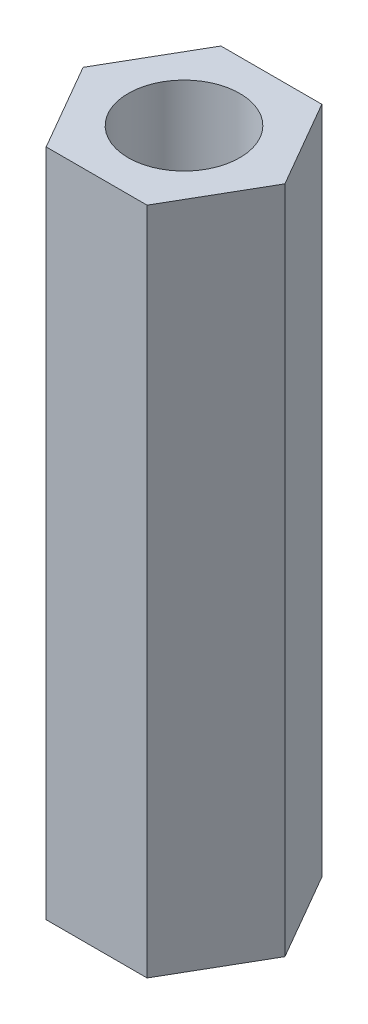
ISO-10303-21;
HEADER;
FILE_DESCRIPTION(('STEP AP214'),'2;1');
FILE_NAME('part.step','',(''),(''),'','','');
FILE_SCHEMA(('AUTOMOTIVE_DESIGN { 1 0 10303 214 1 1 1 1 }'));
ENDSEC;
DATA;
#1=APPLICATION_CONTEXT('core data for automotive mechanical design processes');
#2=APPLICATION_PROTOCOL_DEFINITION('international standard','automotive_design',2000,#1);
#3=PRODUCT_CONTEXT('',#1,'mechanical');
#4=PRODUCT('Part','Part','',(#3));
#5=PRODUCT_RELATED_PRODUCT_CATEGORY('part','',(#4));
#6=PRODUCT_DEFINITION_FORMATION('','',#4);
#7=PRODUCT_DEFINITION_CONTEXT('part definition',#1,'design');
#8=PRODUCT_DEFINITION('design','',#6,#7);
#9=PRODUCT_DEFINITION_SHAPE('','',#8);
#10=(LENGTH_UNIT() NAMED_UNIT(*) SI_UNIT(.MILLI.,.METRE.));
#11=(NAMED_UNIT(*) PLANE_ANGLE_UNIT() SI_UNIT($,.RADIAN.));
#12=(NAMED_UNIT(*) SI_UNIT($,.STERADIAN.) SOLID_ANGLE_UNIT());
#13=UNCERTAINTY_MEASURE_WITH_UNIT(LENGTH_MEASURE(1.E-05),#10,'distance_accuracy_value','');
#14=(GEOMETRIC_REPRESENTATION_CONTEXT(3) GLOBAL_UNCERTAINTY_ASSIGNED_CONTEXT((#13)) GLOBAL_UNIT_ASSIGNED_CONTEXT((#10,
#11,#12)) REPRESENTATION_CONTEXT('',''));
#15=CARTESIAN_POINT('',(0.,0.,0.));
#16=DIRECTION('',(0.,0.,1.));
#17=DIRECTION('',(1.,0.,0.));
#18=AXIS2_PLACEMENT_3D('',#15,#16,#17);
#19=CARTESIAN_POINT('',(0.,18.,0.));
#20=DIRECTION('',(0.,1.,0.));
#21=DIRECTION('',(0.,0.,1.));
#22=AXIS2_PLACEMENT_3D('',#19,#20,#21);
#23=PLANE('',#22);
#24=DIRECTION('',(1.,0.,0.));
#25=VECTOR('',#24,1.);
#26=CARTESIAN_POINT('',(-1.35677313259562,18.,2.35));
#27=LINE('',#26,#25);
#28=CARTESIAN_POINT('',(-1.35677313259562,18.,2.35));
#29=VERTEX_POINT('',#28);
#30=CARTESIAN_POINT('',(1.35677313259562,18.,2.35));
#31=VERTEX_POINT('',#30);
#32=EDGE_CURVE('E135',#29,#31,#27,.T.);
#33=ORIENTED_EDGE('',*,*,#32,.T.);
#34=DIRECTION('',(0.499999999999999,0.,-0.866025403784439));
#35=VECTOR('',#34,1.);
#36=CARTESIAN_POINT('',(1.35677313259562,18.,2.35));
#37=LINE('',#36,#35);
#38=CARTESIAN_POINT('',(2.71354626519124,18.,0.));
#39=VERTEX_POINT('',#38);
#40=EDGE_CURVE('E93',#31,#39,#37,.T.);
#41=ORIENTED_EDGE('',*,*,#40,.T.);
#42=DIRECTION('',(-0.5,0.,-0.866025403784439));
#43=VECTOR('',#42,1.);
#44=CARTESIAN_POINT('',(2.71354626519124,18.,0.));
#45=LINE('',#44,#43);
#46=CARTESIAN_POINT('',(1.35677313259562,18.,-2.35));
#47=VERTEX_POINT('',#46);
#48=EDGE_CURVE('E106',#39,#47,#45,.T.);
#49=ORIENTED_EDGE('',*,*,#48,.T.);
#50=DIRECTION('',(-1.,0.,0.));
#51=VECTOR('',#50,1.);
#52=CARTESIAN_POINT('',(1.35677313259562,18.,-2.35));
#53=LINE('',#52,#51);
#54=CARTESIAN_POINT('',(-1.35677313259562,18.,-2.35));
#55=VERTEX_POINT('',#54);
#56=EDGE_CURVE('E100',#47,#55,#53,.T.);
#57=ORIENTED_EDGE('',*,*,#56,.T.);
#58=DIRECTION('',(-0.499999999999999,0.,0.866025403784439));
#59=VECTOR('',#58,1.);
#60=CARTESIAN_POINT('',(-1.35677313259562,18.,-2.35));
#61=LINE('',#60,#59);
#62=CARTESIAN_POINT('',(-2.71354626519124,18.,0.));
#63=VERTEX_POINT('',#62);
#64=EDGE_CURVE('E104',#55,#63,#61,.T.);
#65=ORIENTED_EDGE('',*,*,#64,.T.);
#66=DIRECTION('',(0.499999999999999,0.,0.866025403784439));
#67=VECTOR('',#66,1.);
#68=CARTESIAN_POINT('',(-2.71354626519124,18.,0.));
#69=LINE('',#68,#67);
#70=EDGE_CURVE('E56',#63,#29,#69,.T.);
#71=ORIENTED_EDGE('',*,*,#70,.T.);
#72=EDGE_LOOP('',(#33,#41,#49,#57,#65,#71));
#73=FACE_BOUND('',#72,.T.);
#74=CARTESIAN_POINT('',(0.,18.,0.));
#75=DIRECTION('',(0.,1.,0.));
#76=DIRECTION('',(0.,0.,1.));
#77=AXIS2_PLACEMENT_3D('',#74,#75,#76);
#78=CIRCLE('',#77,1.5);
#79=CARTESIAN_POINT('',(0.,18.,1.5));
#80=VERTEX_POINT('',#79);
#81=EDGE_CURVE('E128',#80,#80,#78,.T.);
#82=ORIENTED_EDGE('',*,*,#81,.F.);
#83=EDGE_LOOP('',(#82));
#84=FACE_BOUND('',#83,.T.);
#85=ADVANCED_FACE('F39',(#73,#84),#23,.T.);
#86=CARTESIAN_POINT('',(0.,0.,0.));
#87=DIRECTION('',(0.,1.,0.));
#88=DIRECTION('',(0.,0.,1.));
#89=AXIS2_PLACEMENT_3D('',#86,#87,#88);
#90=PLANE('',#89);
#91=DIRECTION('',(1.,0.,0.));
#92=VECTOR('',#91,1.);
#93=CARTESIAN_POINT('',(-1.35677313259562,0.,2.35));
#94=LINE('',#93,#92);
#95=CARTESIAN_POINT('',(-1.35677313259562,0.,2.35));
#96=VERTEX_POINT('',#95);
#97=CARTESIAN_POINT('',(1.35677313259562,0.,2.35));
#98=VERTEX_POINT('',#97);
#99=EDGE_CURVE('E124',#96,#98,#94,.T.);
#100=ORIENTED_EDGE('',*,*,#99,.F.);
#101=DIRECTION('',(0.499999999999999,0.,0.866025403784439));
#102=VECTOR('',#101,1.);
#103=CARTESIAN_POINT('',(-2.71354626519124,0.,0.));
#104=LINE('',#103,#102);
#105=CARTESIAN_POINT('',(-2.71354626519124,0.,0.));
#106=VERTEX_POINT('',#105);
#107=EDGE_CURVE('E85',#106,#96,#104,.T.);
#108=ORIENTED_EDGE('',*,*,#107,.F.);
#109=DIRECTION('',(-0.499999999999999,0.,0.866025403784439));
#110=VECTOR('',#109,1.);
#111=CARTESIAN_POINT('',(-1.35677313259562,0.,-2.35));
#112=LINE('',#111,#110);
#113=CARTESIAN_POINT('',(-1.35677313259562,0.,-2.35));
#114=VERTEX_POINT('',#113);
#115=EDGE_CURVE('E79',#114,#106,#112,.T.);
#116=ORIENTED_EDGE('',*,*,#115,.F.);
#117=DIRECTION('',(-1.,0.,0.));
#118=VECTOR('',#117,1.);
#119=CARTESIAN_POINT('',(1.35677313259562,0.,-2.35));
#120=LINE('',#119,#118);
#121=CARTESIAN_POINT('',(1.35677313259562,0.,-2.35));
#122=VERTEX_POINT('',#121);
#123=EDGE_CURVE('E114',#122,#114,#120,.T.);
#124=ORIENTED_EDGE('',*,*,#123,.F.);
#125=DIRECTION('',(-0.5,0.,-0.866025403784439));
#126=VECTOR('',#125,1.);
#127=CARTESIAN_POINT('',(2.71354626519124,0.,0.));
#128=LINE('',#127,#126);
#129=CARTESIAN_POINT('',(2.71354626519124,0.,0.));
#130=VERTEX_POINT('',#129);
#131=EDGE_CURVE('E130',#130,#122,#128,.T.);
#132=ORIENTED_EDGE('',*,*,#131,.F.);
#133=DIRECTION('',(0.499999999999999,0.,-0.866025403784439));
#134=VECTOR('',#133,1.);
#135=CARTESIAN_POINT('',(1.35677313259562,0.,2.35));
#136=LINE('',#135,#134);
#137=EDGE_CURVE('E127',#98,#130,#136,.T.);
#138=ORIENTED_EDGE('',*,*,#137,.F.);
#139=EDGE_LOOP('',(#100,#108,#116,#124,#132,#138));
#140=FACE_BOUND('',#139,.T.);
#141=CARTESIAN_POINT('',(0.,0.,0.));
#142=DIRECTION('',(0.,1.,0.));
#143=DIRECTION('',(0.,0.,1.));
#144=AXIS2_PLACEMENT_3D('',#141,#142,#143);
#145=CIRCLE('',#144,1.5);
#146=CARTESIAN_POINT('',(0.,0.,1.5));
#147=VERTEX_POINT('',#146);
#148=EDGE_CURVE('E246',#147,#147,#145,.T.);
#149=ORIENTED_EDGE('',*,*,#148,.T.);
#150=EDGE_LOOP('',(#149));
#151=FACE_BOUND('',#150,.T.);
#152=ADVANCED_FACE('F144',(#140,#151),#90,.F.);
#153=CARTESIAN_POINT('',(-1.35677313259562,18.,2.35));
#154=DIRECTION('',(0.,0.,-1.));
#155=DIRECTION('',(-1.,0.,0.));
#156=AXIS2_PLACEMENT_3D('',#153,#154,#155);
#157=PLANE('',#156);
#158=ORIENTED_EDGE('',*,*,#99,.T.);
#159=DIRECTION('',(0.,-1.,0.));
#160=VECTOR('',#159,1.);
#161=CARTESIAN_POINT('',(1.35677313259562,18.,2.35));
#162=LINE('',#161,#160);
#163=EDGE_CURVE('E11',#31,#98,#162,.T.);
#164=ORIENTED_EDGE('',*,*,#163,.F.);
#165=ORIENTED_EDGE('',*,*,#32,.F.);
#166=DIRECTION('',(0.,-1.,0.));
#167=VECTOR('',#166,1.);
#168=CARTESIAN_POINT('',(-1.35677313259562,18.,2.35));
#169=LINE('',#168,#167);
#170=EDGE_CURVE('E120',#29,#96,#169,.T.);
#171=ORIENTED_EDGE('',*,*,#170,.T.);
#172=EDGE_LOOP('',(#158,#164,#165,#171));
#173=FACE_BOUND('',#172,.T.);
#174=ADVANCED_FACE('F41',(#173),#157,.F.);
#175=CARTESIAN_POINT('',(1.35677313259562,18.,2.35));
#176=DIRECTION('',(-0.866025403784439,0.,-0.499999999999999));
#177=DIRECTION('',(-0.499999999999999,0.,0.866025403784439));
#178=AXIS2_PLACEMENT_3D('',#175,#176,#177);
#179=PLANE('',#178);
#180=ORIENTED_EDGE('',*,*,#137,.T.);
#181=DIRECTION('',(0.,-1.,0.));
#182=VECTOR('',#181,1.);
#183=CARTESIAN_POINT('',(2.71354626519124,18.,0.));
#184=LINE('',#183,#182);
#185=EDGE_CURVE('E48',#39,#130,#184,.T.);
#186=ORIENTED_EDGE('',*,*,#185,.F.);
#187=ORIENTED_EDGE('',*,*,#40,.F.);
#188=ORIENTED_EDGE('',*,*,#163,.T.);
#189=EDGE_LOOP('',(#180,#186,#187,#188));
#190=FACE_BOUND('',#189,.T.);
#191=ADVANCED_FACE('F169',(#190),#179,.F.);
#192=CARTESIAN_POINT('',(2.71354626519124,18.,0.));
#193=DIRECTION('',(-0.866025403784439,0.,0.5));
#194=DIRECTION('',(0.5,0.,0.866025403784439));
#195=AXIS2_PLACEMENT_3D('',#192,#193,#194);
#196=PLANE('',#195);
#197=ORIENTED_EDGE('',*,*,#131,.T.);
#198=DIRECTION('',(0.,-1.,0.));
#199=VECTOR('',#198,1.);
#200=CARTESIAN_POINT('',(1.35677313259562,18.,-2.35));
#201=LINE('',#200,#199);
#202=EDGE_CURVE('E115',#47,#122,#201,.T.);
#203=ORIENTED_EDGE('',*,*,#202,.F.);
#204=ORIENTED_EDGE('',*,*,#48,.F.);
#205=ORIENTED_EDGE('',*,*,#185,.T.);
#206=EDGE_LOOP('',(#197,#203,#204,#205));
#207=FACE_BOUND('',#206,.T.);
#208=ADVANCED_FACE('F141',(#207),#196,.F.);
#209=CARTESIAN_POINT('',(1.35677313259562,18.,-2.35));
#210=DIRECTION('',(0.,0.,1.));
#211=DIRECTION('',(1.,0.,0.));
#212=AXIS2_PLACEMENT_3D('',#209,#210,#211);
#213=PLANE('',#212);
#214=ORIENTED_EDGE('',*,*,#123,.T.);
#215=DIRECTION('',(0.,-1.,0.));
#216=VECTOR('',#215,1.);
#217=CARTESIAN_POINT('',(-1.35677313259562,18.,-2.35));
#218=LINE('',#217,#216);
#219=EDGE_CURVE('E111',#55,#114,#218,.T.);
#220=ORIENTED_EDGE('',*,*,#219,.F.);
#221=ORIENTED_EDGE('',*,*,#56,.F.);
#222=ORIENTED_EDGE('',*,*,#202,.T.);
#223=EDGE_LOOP('',(#214,#220,#221,#222));
#224=FACE_BOUND('',#223,.T.);
#225=ADVANCED_FACE('F112',(#224),#213,.F.);
#226=CARTESIAN_POINT('',(-1.35677313259562,18.,-2.35));
#227=DIRECTION('',(0.866025403784439,0.,0.499999999999999));
#228=DIRECTION('',(0.499999999999999,0.,-0.866025403784439));
#229=AXIS2_PLACEMENT_3D('',#226,#227,#228);
#230=PLANE('',#229);
#231=ORIENTED_EDGE('',*,*,#115,.T.);
#232=DIRECTION('',(0.,-1.,0.));
#233=VECTOR('',#232,1.);
#234=CARTESIAN_POINT('',(-2.71354626519124,18.,0.));
#235=LINE('',#234,#233);
#236=EDGE_CURVE('E116',#63,#106,#235,.T.);
#237=ORIENTED_EDGE('',*,*,#236,.F.);
#238=ORIENTED_EDGE('',*,*,#64,.F.);
#239=ORIENTED_EDGE('',*,*,#219,.T.);
#240=EDGE_LOOP('',(#231,#237,#238,#239));
#241=FACE_BOUND('',#240,.T.);
#242=ADVANCED_FACE('F118',(#241),#230,.F.);
#243=CARTESIAN_POINT('',(-2.71354626519124,18.,0.));
#244=DIRECTION('',(0.866025403784439,0.,-0.499999999999999));
#245=DIRECTION('',(-0.499999999999999,0.,-0.866025403784439));
#246=AXIS2_PLACEMENT_3D('',#243,#244,#245);
#247=PLANE('',#246);
#248=ORIENTED_EDGE('',*,*,#107,.T.);
#249=ORIENTED_EDGE('',*,*,#170,.F.);
#250=ORIENTED_EDGE('',*,*,#70,.F.);
#251=ORIENTED_EDGE('',*,*,#236,.T.);
#252=EDGE_LOOP('',(#248,#249,#250,#251));
#253=FACE_BOUND('',#252,.T.);
#254=ADVANCED_FACE('F149',(#253),#247,.F.);
#255=CARTESIAN_POINT('',(0.,18.,0.));
#256=DIRECTION('',(0.,-1.,0.));
#257=DIRECTION('',(0.,0.,-1.));
#258=AXIS2_PLACEMENT_3D('',#255,#256,#257);
#259=CYLINDRICAL_SURFACE('',#258,1.5);
#260=ORIENTED_EDGE('',*,*,#81,.T.);
#261=EDGE_LOOP('',(#260));
#262=FACE_BOUND('',#261,.T.);
#263=ORIENTED_EDGE('',*,*,#148,.F.);
#264=EDGE_LOOP('',(#263));
#265=FACE_BOUND('',#264,.T.);
#266=ADVANCED_FACE('F151',(#262,#265),#259,.F.);
#267=CLOSED_SHELL('',(#85,#152,#174,#191,#208,#225,#242,#254,#266));
#268=MANIFOLD_SOLID_BREP('B2',#267);
#269=ADVANCED_BREP_SHAPE_REPRESENTATION('',(#18,#268),#14);
#270=SHAPE_DEFINITION_REPRESENTATION(#9,#269);
ENDSEC;
END-ISO-10303-21;
